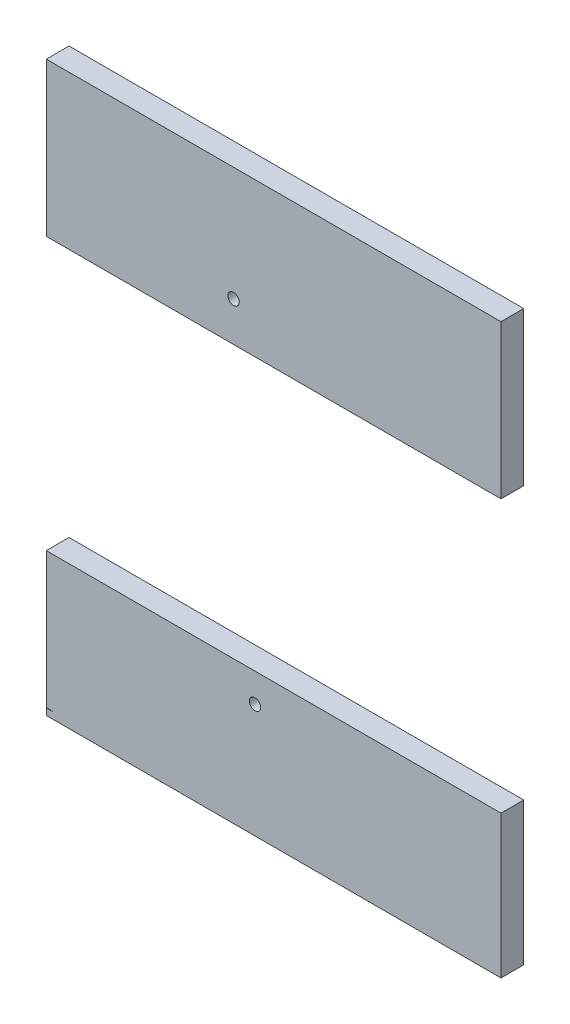
ISO-10303-21;
HEADER;
FILE_DESCRIPTION(('STEP AP214'),'2;1');
FILE_NAME('part.step','',(''),(''),'','','');
FILE_SCHEMA(('AUTOMOTIVE_DESIGN { 1 0 10303 214 1 1 1 1 }'));
ENDSEC;
DATA;
#1=APPLICATION_CONTEXT('core data for automotive mechanical design processes');
#2=APPLICATION_PROTOCOL_DEFINITION('international standard','automotive_design',2000,#1);
#3=PRODUCT_CONTEXT('',#1,'mechanical');
#4=PRODUCT('Part','Part','',(#3));
#5=PRODUCT_RELATED_PRODUCT_CATEGORY('part','',(#4));
#6=PRODUCT_DEFINITION_FORMATION('','',#4);
#7=PRODUCT_DEFINITION_CONTEXT('part definition',#1,'design');
#8=PRODUCT_DEFINITION('design','',#6,#7);
#9=PRODUCT_DEFINITION_SHAPE('','',#8);
#10=(LENGTH_UNIT() NAMED_UNIT(*) SI_UNIT(.MILLI.,.METRE.));
#11=(NAMED_UNIT(*) PLANE_ANGLE_UNIT() SI_UNIT($,.RADIAN.));
#12=(NAMED_UNIT(*) SI_UNIT($,.STERADIAN.) SOLID_ANGLE_UNIT());
#13=UNCERTAINTY_MEASURE_WITH_UNIT(LENGTH_MEASURE(1.E-05),#10,'distance_accuracy_value','');
#14=(GEOMETRIC_REPRESENTATION_CONTEXT(3) GLOBAL_UNCERTAINTY_ASSIGNED_CONTEXT((#13)) GLOBAL_UNIT_ASSIGNED_CONTEXT((#10,
#11,#12)) REPRESENTATION_CONTEXT('',''));
#15=CARTESIAN_POINT('',(0.,0.,0.));
#16=DIRECTION('',(0.,0.,1.));
#17=DIRECTION('',(1.,0.,0.));
#18=AXIS2_PLACEMENT_3D('',#15,#16,#17);
#19=CARTESIAN_POINT('',(0.0665366000004486,-93.6665366,0.));
#20=DIRECTION('',(0.,0.,1.));
#21=DIRECTION('',(1.,0.,0.));
#22=AXIS2_PLACEMENT_3D('',#19,#20,#21);
#23=PLANE('',#22);
#24=CARTESIAN_POINT('',(-8.12417443530146,-74.9185412321204,0.));
#25=DIRECTION('',(0.,0.,-1.));
#26=DIRECTION('',(-1.,0.,0.));
#27=AXIS2_PLACEMENT_3D('',#24,#25,#26);
#28=CIRCLE('',#27,2.5);
#29=CARTESIAN_POINT('',(-5.62417443530146,-74.9185412321204,0.));
#30=VERTEX_POINT('',#29);
#31=EDGE_CURVE('P0_E111',#30,#30,#28,.T.);
#32=ORIENTED_EDGE('',*,*,#31,.F.);
#33=EDGE_LOOP('',(#32));
#34=FACE_BOUND('',#33,.T.);
#35=DIRECTION('',(-1.,0.,0.));
#36=VECTOR('',#35,1.);
#37=CARTESIAN_POINT('',(100.066536600001,-62.2665366,0.));
#38=LINE('',#37,#36);
#39=CARTESIAN_POINT('',(100.066536600001,-62.2665366,0.));
#40=VERTEX_POINT('',#39);
#41=CARTESIAN_POINT('',(-99.9334633999999,-62.2665366235759,0.));
#42=VERTEX_POINT('',#41);
#43=EDGE_CURVE('P0_E25',#40,#42,#38,.T.);
#44=ORIENTED_EDGE('',*,*,#43,.F.);
#45=DIRECTION('',(0.,1.,0.));
#46=VECTOR('',#45,1.);
#47=CARTESIAN_POINT('',(100.0665366,-125.0665366,0.));
#48=LINE('',#47,#46);
#49=CARTESIAN_POINT('',(100.0665366,-125.0665366,0.));
#50=VERTEX_POINT('',#49);
#51=EDGE_CURVE('P0_E130',#50,#40,#48,.T.);
#52=ORIENTED_EDGE('',*,*,#51,.F.);
#53=DIRECTION('',(1.,0.,0.));
#54=VECTOR('',#53,1.);
#55=CARTESIAN_POINT('',(-99.9334634,-125.0665366,0.));
#56=LINE('',#55,#54);
#57=CARTESIAN_POINT('',(-99.9334634,-125.0665366,0.));
#58=VERTEX_POINT('',#57);
#59=EDGE_CURVE('P0_E150',#58,#50,#56,.T.);
#60=ORIENTED_EDGE('',*,*,#59,.F.);
#61=DIRECTION('',(0.,-1.,0.));
#62=VECTOR('',#61,1.);
#63=CARTESIAN_POINT('',(-99.9334634,124.9334634,0.));
#64=LINE('',#63,#62);
#65=CARTESIAN_POINT('',(-99.9334633999999,-122.166536623576,0.));
#66=VERTEX_POINT('',#65);
#67=EDGE_CURVE('P0_E136',#66,#58,#64,.T.);
#68=ORIENTED_EDGE('',*,*,#67,.F.);
#69=DIRECTION('',(-1.,0.,0.));
#70=VECTOR('',#69,1.);
#71=CARTESIAN_POINT('',(-96.9334634,-122.166536623576,0.));
#72=LINE('',#71,#70);
#73=CARTESIAN_POINT('',(-96.9334634,-122.166536623576,0.));
#74=VERTEX_POINT('',#73);
#75=EDGE_CURVE('P0_E169',#74,#66,#72,.T.);
#76=ORIENTED_EDGE('',*,*,#75,.F.);
#77=DIRECTION('',(0.,-1.,0.));
#78=VECTOR('',#77,1.);
#79=CARTESIAN_POINT('',(-96.9334634000001,-102.166536623576,0.));
#80=LINE('',#79,#78);
#81=CARTESIAN_POINT('',(-96.9334634,-122.0665366,0.));
#82=VERTEX_POINT('',#81);
#83=EDGE_CURVE('P0_E159',#82,#74,#80,.T.);
#84=ORIENTED_EDGE('',*,*,#83,.F.);
#85=DIRECTION('',(1.,0.,0.));
#86=VECTOR('',#85,1.);
#87=CARTESIAN_POINT('',(-99.9334634,-122.0665366,0.));
#88=LINE('',#87,#86);
#89=CARTESIAN_POINT('',(-99.9334634,-122.0665366,0.));
#90=VERTEX_POINT('',#89);
#91=EDGE_CURVE('P0_E181',#90,#82,#88,.T.);
#92=ORIENTED_EDGE('',*,*,#91,.F.);
#93=DIRECTION('',(0.,-1.,0.));
#94=VECTOR('',#93,1.);
#95=CARTESIAN_POINT('',(-99.9334634,124.9334634,0.));
#96=LINE('',#95,#94);
#97=EDGE_CURVE('P0_E195',#42,#90,#96,.T.);
#98=ORIENTED_EDGE('',*,*,#97,.F.);
#99=EDGE_LOOP('',(#44,#52,#60,#68,#76,#84,#92,#98));
#100=FACE_BOUND('',#99,.T.);
#101=ADVANCED_FACE('P0_F17',(#34,#100),#23,.F.);
#102=CARTESIAN_POINT('',(0.0665366000004486,-93.6665366,10.));
#103=DIRECTION('',(0.,0.,1.));
#104=DIRECTION('',(1.,0.,0.));
#105=AXIS2_PLACEMENT_3D('',#102,#103,#104);
#106=PLANE('',#105);
#107=CARTESIAN_POINT('',(-8.12417443530146,-74.9185412321204,10.));
#108=DIRECTION('',(0.,0.,-1.));
#109=DIRECTION('',(-1.,0.,0.));
#110=AXIS2_PLACEMENT_3D('',#107,#108,#109);
#111=CIRCLE('',#110,2.5);
#112=CARTESIAN_POINT('',(-5.62417443530146,-74.9185412321204,10.));
#113=VERTEX_POINT('',#112);
#114=EDGE_CURVE('P0_E115',#113,#113,#111,.T.);
#115=ORIENTED_EDGE('',*,*,#114,.T.);
#116=EDGE_LOOP('',(#115));
#117=FACE_BOUND('',#116,.T.);
#118=DIRECTION('',(-1.,0.,0.));
#119=VECTOR('',#118,1.);
#120=CARTESIAN_POINT('',(100.066536600001,-62.2665366,10.));
#121=LINE('',#120,#119);
#122=CARTESIAN_POINT('',(100.066536600001,-62.2665366,10.));
#123=VERTEX_POINT('',#122);
#124=CARTESIAN_POINT('',(-99.9334633999999,-62.2665366235759,10.));
#125=VERTEX_POINT('',#124);
#126=EDGE_CURVE('P0_E11',#123,#125,#121,.T.);
#127=ORIENTED_EDGE('',*,*,#126,.T.);
#128=DIRECTION('',(0.,-1.,0.));
#129=VECTOR('',#128,1.);
#130=CARTESIAN_POINT('',(-99.9334634,124.9334634,10.));
#131=LINE('',#130,#129);
#132=CARTESIAN_POINT('',(-99.9334633999999,-122.0665366,10.));
#133=VERTEX_POINT('',#132);
#134=EDGE_CURVE('P0_E194',#125,#133,#131,.T.);
#135=ORIENTED_EDGE('',*,*,#134,.T.);
#136=DIRECTION('',(1.,0.,0.));
#137=VECTOR('',#136,1.);
#138=CARTESIAN_POINT('',(-99.9334634,-122.0665366,10.));
#139=LINE('',#138,#137);
#140=CARTESIAN_POINT('',(-96.9334634,-122.0665366,10.));
#141=VERTEX_POINT('',#140);
#142=EDGE_CURVE('P0_E184',#133,#141,#139,.T.);
#143=ORIENTED_EDGE('',*,*,#142,.T.);
#144=DIRECTION('',(0.,-1.,0.));
#145=VECTOR('',#144,1.);
#146=CARTESIAN_POINT('',(-96.9334634000001,-102.166536623576,10.));
#147=LINE('',#146,#145);
#148=CARTESIAN_POINT('',(-96.9334634,-122.166536623576,10.));
#149=VERTEX_POINT('',#148);
#150=EDGE_CURVE('P0_E175',#141,#149,#147,.T.);
#151=ORIENTED_EDGE('',*,*,#150,.T.);
#152=DIRECTION('',(-1.,0.,0.));
#153=VECTOR('',#152,1.);
#154=CARTESIAN_POINT('',(-96.9334634,-122.166536623576,10.));
#155=LINE('',#154,#153);
#156=CARTESIAN_POINT('',(-99.9334633999999,-122.166536623576,10.));
#157=VERTEX_POINT('',#156);
#158=EDGE_CURVE('P0_E161',#149,#157,#155,.T.);
#159=ORIENTED_EDGE('',*,*,#158,.T.);
#160=DIRECTION('',(0.,-1.,0.));
#161=VECTOR('',#160,1.);
#162=CARTESIAN_POINT('',(-99.9334634,124.9334634,10.));
#163=LINE('',#162,#161);
#164=CARTESIAN_POINT('',(-99.9334633999999,-125.0665366,10.));
#165=VERTEX_POINT('',#164);
#166=EDGE_CURVE('P0_E137',#157,#165,#163,.T.);
#167=ORIENTED_EDGE('',*,*,#166,.T.);
#168=DIRECTION('',(1.,0.,0.));
#169=VECTOR('',#168,1.);
#170=CARTESIAN_POINT('',(-99.9334634,-125.0665366,10.));
#171=LINE('',#170,#169);
#172=CARTESIAN_POINT('',(100.0665366,-125.0665366,10.));
#173=VERTEX_POINT('',#172);
#174=EDGE_CURVE('P0_E147',#165,#173,#171,.T.);
#175=ORIENTED_EDGE('',*,*,#174,.T.);
#176=DIRECTION('',(0.,1.,0.));
#177=VECTOR('',#176,1.);
#178=CARTESIAN_POINT('',(100.0665366,-125.0665366,10.));
#179=LINE('',#178,#177);
#180=EDGE_CURVE('P0_E134',#173,#123,#179,.T.);
#181=ORIENTED_EDGE('',*,*,#180,.T.);
#182=EDGE_LOOP('',(#127,#135,#143,#151,#159,#167,#175,#181));
#183=FACE_BOUND('',#182,.T.);
#184=ADVANCED_FACE('P0_F119',(#117,#183),#106,.T.);
#185=CARTESIAN_POINT('',(100.066536600001,-62.2665366,0.));
#186=DIRECTION('',(0.,1.,0.));
#187=DIRECTION('',(1.,0.,0.));
#188=AXIS2_PLACEMENT_3D('',#185,#186,#187);
#189=PLANE('',#188);
#190=ORIENTED_EDGE('',*,*,#43,.T.);
#191=DIRECTION('',(0.,0.,1.));
#192=VECTOR('',#191,1.);
#193=CARTESIAN_POINT('',(-99.9334633999999,-62.2665366235759,0.));
#194=LINE('',#193,#192);
#195=EDGE_CURVE('P0_E196',#42,#125,#194,.T.);
#196=ORIENTED_EDGE('',*,*,#195,.T.);
#197=ORIENTED_EDGE('',*,*,#126,.F.);
#198=DIRECTION('',(0.,0.,1.));
#199=VECTOR('',#198,1.);
#200=CARTESIAN_POINT('',(100.066536600001,-62.2665366,0.));
#201=LINE('',#200,#199);
#202=EDGE_CURVE('P0_E131',#40,#123,#201,.T.);
#203=ORIENTED_EDGE('',*,*,#202,.F.);
#204=EDGE_LOOP('',(#190,#196,#197,#203));
#205=FACE_BOUND('',#204,.T.);
#206=ADVANCED_FACE('P0_F300',(#205),#189,.T.);
#207=CARTESIAN_POINT('',(-99.9334634,-62.2665366235759,0.));
#208=DIRECTION('',(-1.,0.,0.));
#209=DIRECTION('',(0.,1.,0.));
#210=AXIS2_PLACEMENT_3D('',#207,#208,#209);
#211=PLANE('',#210);
#212=ORIENTED_EDGE('',*,*,#97,.T.);
#213=DIRECTION('',(0.,0.,1.));
#214=VECTOR('',#213,1.);
#215=CARTESIAN_POINT('',(-99.9334634,-122.0665366,0.));
#216=LINE('',#215,#214);
#217=EDGE_CURVE('P0_E187',#90,#133,#216,.T.);
#218=ORIENTED_EDGE('',*,*,#217,.T.);
#219=ORIENTED_EDGE('',*,*,#134,.F.);
#220=ORIENTED_EDGE('',*,*,#195,.F.);
#221=EDGE_LOOP('',(#212,#218,#219,#220));
#222=FACE_BOUND('',#221,.T.);
#223=ADVANCED_FACE('P0_F291',(#222),#211,.T.);
#224=CARTESIAN_POINT('',(-99.9334634,-122.0665366,0.));
#225=DIRECTION('',(0.,-1.,0.));
#226=DIRECTION('',(0.,0.,-1.));
#227=AXIS2_PLACEMENT_3D('',#224,#225,#226);
#228=PLANE('',#227);
#229=ORIENTED_EDGE('',*,*,#91,.T.);
#230=DIRECTION('',(0.,0.,1.));
#231=VECTOR('',#230,1.);
#232=CARTESIAN_POINT('',(-96.9334634,-122.0665366,0.));
#233=LINE('',#232,#231);
#234=EDGE_CURVE('P0_E178',#82,#141,#233,.T.);
#235=ORIENTED_EDGE('',*,*,#234,.T.);
#236=ORIENTED_EDGE('',*,*,#142,.F.);
#237=ORIENTED_EDGE('',*,*,#217,.F.);
#238=EDGE_LOOP('',(#229,#235,#236,#237));
#239=FACE_BOUND('',#238,.T.);
#240=ADVANCED_FACE('P0_F296',(#239),#228,.T.);
#241=CARTESIAN_POINT('',(-96.9334634,-122.0665366,0.));
#242=DIRECTION('',(-1.,0.,0.));
#243=DIRECTION('',(0.,1.,0.));
#244=AXIS2_PLACEMENT_3D('',#241,#242,#243);
#245=PLANE('',#244);
#246=ORIENTED_EDGE('',*,*,#83,.T.);
#247=DIRECTION('',(0.,0.,1.));
#248=VECTOR('',#247,1.);
#249=CARTESIAN_POINT('',(-96.9334634,-122.166536623576,0.));
#250=LINE('',#249,#248);
#251=EDGE_CURVE('P0_E156',#74,#149,#250,.T.);
#252=ORIENTED_EDGE('',*,*,#251,.T.);
#253=ORIENTED_EDGE('',*,*,#150,.F.);
#254=ORIENTED_EDGE('',*,*,#234,.F.);
#255=EDGE_LOOP('',(#246,#252,#253,#254));
#256=FACE_BOUND('',#255,.T.);
#257=ADVANCED_FACE('P0_F304',(#256),#245,.T.);
#258=CARTESIAN_POINT('',(-96.9334634,-122.166536623576,0.));
#259=DIRECTION('',(0.,1.,0.));
#260=DIRECTION('',(1.,0.,0.));
#261=AXIS2_PLACEMENT_3D('',#258,#259,#260);
#262=PLANE('',#261);
#263=ORIENTED_EDGE('',*,*,#75,.T.);
#264=DIRECTION('',(0.,0.,1.));
#265=VECTOR('',#264,1.);
#266=CARTESIAN_POINT('',(-99.9334633999999,-122.166536623576,0.));
#267=LINE('',#266,#265);
#268=EDGE_CURVE('P0_E163',#66,#157,#267,.T.);
#269=ORIENTED_EDGE('',*,*,#268,.T.);
#270=ORIENTED_EDGE('',*,*,#158,.F.);
#271=ORIENTED_EDGE('',*,*,#251,.F.);
#272=EDGE_LOOP('',(#263,#269,#270,#271));
#273=FACE_BOUND('',#272,.T.);
#274=ADVANCED_FACE('P0_F313',(#273),#262,.T.);
#275=CARTESIAN_POINT('',(-99.9334634,-122.166536623576,0.));
#276=DIRECTION('',(-1.,0.,0.));
#277=DIRECTION('',(0.,1.,0.));
#278=AXIS2_PLACEMENT_3D('',#275,#276,#277);
#279=PLANE('',#278);
#280=ORIENTED_EDGE('',*,*,#67,.T.);
#281=DIRECTION('',(0.,0.,1.));
#282=VECTOR('',#281,1.);
#283=CARTESIAN_POINT('',(-99.9334634,-125.0665366,0.));
#284=LINE('',#283,#282);
#285=EDGE_CURVE('P0_E139',#58,#165,#284,.T.);
#286=ORIENTED_EDGE('',*,*,#285,.T.);
#287=ORIENTED_EDGE('',*,*,#166,.F.);
#288=ORIENTED_EDGE('',*,*,#268,.F.);
#289=EDGE_LOOP('',(#280,#286,#287,#288));
#290=FACE_BOUND('',#289,.T.);
#291=ADVANCED_FACE('P0_F312',(#290),#279,.T.);
#292=CARTESIAN_POINT('',(-99.9334634,-125.0665366,0.));
#293=DIRECTION('',(0.,-1.,0.));
#294=DIRECTION('',(0.,0.,-1.));
#295=AXIS2_PLACEMENT_3D('',#292,#293,#294);
#296=PLANE('',#295);
#297=ORIENTED_EDGE('',*,*,#59,.T.);
#298=DIRECTION('',(0.,0.,1.));
#299=VECTOR('',#298,1.);
#300=CARTESIAN_POINT('',(100.0665366,-125.0665366,0.));
#301=LINE('',#300,#299);
#302=EDGE_CURVE('P0_E141',#50,#173,#301,.T.);
#303=ORIENTED_EDGE('',*,*,#302,.T.);
#304=ORIENTED_EDGE('',*,*,#174,.F.);
#305=ORIENTED_EDGE('',*,*,#285,.F.);
#306=EDGE_LOOP('',(#297,#303,#304,#305));
#307=FACE_BOUND('',#306,.T.);
#308=ADVANCED_FACE('P0_F322',(#307),#296,.T.);
#309=CARTESIAN_POINT('',(100.0665366,-125.0665366,0.));
#310=DIRECTION('',(1.,0.,0.));
#311=DIRECTION('',(0.,1.,0.));
#312=AXIS2_PLACEMENT_3D('',#309,#310,#311);
#313=PLANE('',#312);
#314=ORIENTED_EDGE('',*,*,#51,.T.);
#315=ORIENTED_EDGE('',*,*,#202,.T.);
#316=ORIENTED_EDGE('',*,*,#180,.F.);
#317=ORIENTED_EDGE('',*,*,#302,.F.);
#318=EDGE_LOOP('',(#314,#315,#316,#317));
#319=FACE_BOUND('',#318,.T.);
#320=ADVANCED_FACE('P0_F340',(#319),#313,.T.);
#321=CARTESIAN_POINT('',(-8.12417443530146,-74.9185412321204,0.));
#322=DIRECTION('',(0.,0.,1.));
#323=DIRECTION('',(-1.,0.,0.));
#324=AXIS2_PLACEMENT_3D('',#321,#322,#323);
#325=CYLINDRICAL_SURFACE('',#324,2.5);
#326=ORIENTED_EDGE('',*,*,#114,.F.);
#327=DIRECTION('',(0.,0.,-1.));
#328=VECTOR('',#327,1.);
#329=CARTESIAN_POINT('',(-5.62417443530146,-74.9185412321204,0.));
#330=LINE('',#329,#328);
#331=EDGE_CURVE('P0_E108',#113,#30,#330,.T.);
#332=ORIENTED_EDGE('',*,*,#331,.T.);
#333=ORIENTED_EDGE('',*,*,#31,.T.);
#334=ORIENTED_EDGE('',*,*,#331,.F.);
#335=EDGE_LOOP('',(#326,#332,#333,#334));
#336=FACE_BOUND('',#335,.T.);
#337=ADVANCED_FACE('P0_F112',(#336),#325,.F.);
#338=CLOSED_SHELL('',(#101,#184,#206,#223,#240,#257,#274,#291,#308,#320,#337));
#339=MANIFOLD_SOLID_BREP('P0_B1',#338);
#340=CARTESIAN_POINT('',(0.0665366000001111,91.1834634,0.));
#341=DIRECTION('',(0.,0.,1.));
#342=DIRECTION('',(1.,0.,0.));
#343=AXIS2_PLACEMENT_3D('',#340,#341,#342);
#344=PLANE('',#343);
#345=CARTESIAN_POINT('',(-17.5427523646985,74.7854680321204,0.));
#346=DIRECTION('',(0.,0.,-1.));
#347=DIRECTION('',(-1.,0.,0.));
#348=AXIS2_PLACEMENT_3D('',#345,#346,#347);
#349=CIRCLE('',#348,2.5);
#350=CARTESIAN_POINT('',(-15.0427523646985,74.7854680321204,0.));
#351=VERTEX_POINT('',#350);
#352=EDGE_CURVE('P1_E80',#351,#351,#349,.T.);
#353=ORIENTED_EDGE('',*,*,#352,.F.);
#354=EDGE_LOOP('',(#353));
#355=FACE_BOUND('',#354,.T.);
#356=DIRECTION('',(1.,0.,0.));
#357=VECTOR('',#356,1.);
#358=CARTESIAN_POINT('',(97.0665366000009,57.4334634,0.));
#359=LINE('',#358,#357);
#360=CARTESIAN_POINT('',(-99.9334634,57.4334633764241,0.));
#361=VERTEX_POINT('',#360);
#362=CARTESIAN_POINT('',(100.0665366,57.4334634,0.));
#363=VERTEX_POINT('',#362);
#364=EDGE_CURVE('P1_E20',#361,#363,#359,.T.);
#365=ORIENTED_EDGE('',*,*,#364,.F.);
#366=DIRECTION('',(0.,-1.,0.));
#367=VECTOR('',#366,1.);
#368=CARTESIAN_POINT('',(-99.9334634,124.9334634,0.));
#369=LINE('',#368,#367);
#370=CARTESIAN_POINT('',(-99.9334634,124.9334634,0.));
#371=VERTEX_POINT('',#370);
#372=EDGE_CURVE('P1_E92',#371,#361,#369,.T.);
#373=ORIENTED_EDGE('',*,*,#372,.F.);
#374=DIRECTION('',(-1.,0.,0.));
#375=VECTOR('',#374,1.);
#376=CARTESIAN_POINT('',(77.0665366,124.9334634,0.));
#377=LINE('',#376,#375);
#378=CARTESIAN_POINT('',(100.0665366,124.9334634,0.));
#379=VERTEX_POINT('',#378);
#380=EDGE_CURVE('P1_E109',#379,#371,#377,.T.);
#381=ORIENTED_EDGE('',*,*,#380,.F.);
#382=DIRECTION('',(0.,1.,0.));
#383=VECTOR('',#382,1.);
#384=CARTESIAN_POINT('',(100.0665366,-125.0665366,0.));
#385=LINE('',#384,#383);
#386=EDGE_CURVE('P1_E93',#363,#379,#385,.T.);
#387=ORIENTED_EDGE('',*,*,#386,.F.);
#388=EDGE_LOOP('',(#365,#373,#381,#387));
#389=FACE_BOUND('',#388,.T.);
#390=ADVANCED_FACE('P1_F17',(#355,#389),#344,.F.);
#391=CARTESIAN_POINT('',(0.0665366000001111,91.1834634,10.));
#392=DIRECTION('',(0.,0.,1.));
#393=DIRECTION('',(1.,0.,0.));
#394=AXIS2_PLACEMENT_3D('',#391,#392,#393);
#395=PLANE('',#394);
#396=CARTESIAN_POINT('',(-17.5427523646985,74.7854680321204,10.));
#397=DIRECTION('',(0.,0.,-1.));
#398=DIRECTION('',(-1.,0.,0.));
#399=AXIS2_PLACEMENT_3D('',#396,#397,#398);
#400=CIRCLE('',#399,2.5);
#401=CARTESIAN_POINT('',(-15.0427523646985,74.7854680321204,10.));
#402=VERTEX_POINT('',#401);
#403=EDGE_CURVE('P1_E74',#402,#402,#400,.T.);
#404=ORIENTED_EDGE('',*,*,#403,.T.);
#405=EDGE_LOOP('',(#404));
#406=FACE_BOUND('',#405,.T.);
#407=DIRECTION('',(1.,0.,0.));
#408=VECTOR('',#407,1.);
#409=CARTESIAN_POINT('',(97.0665366000009,57.4334634,10.));
#410=LINE('',#409,#408);
#411=CARTESIAN_POINT('',(-99.9334634,57.4334633764241,10.));
#412=VERTEX_POINT('',#411);
#413=CARTESIAN_POINT('',(100.0665366,57.4334634,10.));
#414=VERTEX_POINT('',#413);
#415=EDGE_CURVE('P1_E11',#412,#414,#410,.T.);
#416=ORIENTED_EDGE('',*,*,#415,.T.);
#417=DIRECTION('',(0.,1.,0.));
#418=VECTOR('',#417,1.);
#419=CARTESIAN_POINT('',(100.0665366,-125.0665366,10.));
#420=LINE('',#419,#418);
#421=CARTESIAN_POINT('',(100.0665366,124.9334634,10.));
#422=VERTEX_POINT('',#421);
#423=EDGE_CURVE('P1_E86',#414,#422,#420,.T.);
#424=ORIENTED_EDGE('',*,*,#423,.T.);
#425=DIRECTION('',(-1.,0.,0.));
#426=VECTOR('',#425,1.);
#427=CARTESIAN_POINT('',(77.0665366,124.9334634,10.));
#428=LINE('',#427,#426);
#429=CARTESIAN_POINT('',(-99.9334634,124.9334634,10.));
#430=VERTEX_POINT('',#429);
#431=EDGE_CURVE('P1_E114',#422,#430,#428,.T.);
#432=ORIENTED_EDGE('',*,*,#431,.T.);
#433=DIRECTION('',(0.,-1.,0.));
#434=VECTOR('',#433,1.);
#435=CARTESIAN_POINT('',(-99.9334634,124.9334634,10.));
#436=LINE('',#435,#434);
#437=EDGE_CURVE('P1_E99',#430,#412,#436,.T.);
#438=ORIENTED_EDGE('',*,*,#437,.T.);
#439=EDGE_LOOP('',(#416,#424,#432,#438));
#440=FACE_BOUND('',#439,.T.);
#441=ADVANCED_FACE('P1_F81',(#406,#440),#395,.T.);
#442=CARTESIAN_POINT('',(-99.9334634,57.4334633999994,0.));
#443=DIRECTION('',(0.,-1.,0.));
#444=DIRECTION('',(0.,0.,-1.));
#445=AXIS2_PLACEMENT_3D('',#442,#443,#444);
#446=PLANE('',#445);
#447=ORIENTED_EDGE('',*,*,#364,.T.);
#448=DIRECTION('',(0.,0.,1.));
#449=VECTOR('',#448,1.);
#450=CARTESIAN_POINT('',(100.0665366,57.4334634,0.));
#451=LINE('',#450,#449);
#452=EDGE_CURVE('P1_E89',#363,#414,#451,.T.);
#453=ORIENTED_EDGE('',*,*,#452,.T.);
#454=ORIENTED_EDGE('',*,*,#415,.F.);
#455=DIRECTION('',(0.,0.,1.));
#456=VECTOR('',#455,1.);
#457=CARTESIAN_POINT('',(-99.9334634,57.4334633764241,0.));
#458=LINE('',#457,#456);
#459=EDGE_CURVE('P1_E97',#361,#412,#458,.T.);
#460=ORIENTED_EDGE('',*,*,#459,.F.);
#461=EDGE_LOOP('',(#447,#453,#454,#460));
#462=FACE_BOUND('',#461,.T.);
#463=ADVANCED_FACE('P1_F141',(#462),#446,.T.);
#464=CARTESIAN_POINT('',(100.0665366,57.4334634,0.));
#465=DIRECTION('',(1.,0.,0.));
#466=DIRECTION('',(0.,1.,0.));
#467=AXIS2_PLACEMENT_3D('',#464,#465,#466);
#468=PLANE('',#467);
#469=ORIENTED_EDGE('',*,*,#386,.T.);
#470=DIRECTION('',(0.,0.,1.));
#471=VECTOR('',#470,1.);
#472=CARTESIAN_POINT('',(100.0665366,124.9334634,0.));
#473=LINE('',#472,#471);
#474=EDGE_CURVE('P1_E116',#379,#422,#473,.T.);
#475=ORIENTED_EDGE('',*,*,#474,.T.);
#476=ORIENTED_EDGE('',*,*,#423,.F.);
#477=ORIENTED_EDGE('',*,*,#452,.F.);
#478=EDGE_LOOP('',(#469,#475,#476,#477));
#479=FACE_BOUND('',#478,.T.);
#480=ADVANCED_FACE('P1_F127',(#479),#468,.T.);
#481=CARTESIAN_POINT('',(100.0665366,124.9334634,0.));
#482=DIRECTION('',(0.,1.,0.));
#483=DIRECTION('',(1.,0.,0.));
#484=AXIS2_PLACEMENT_3D('',#481,#482,#483);
#485=PLANE('',#484);
#486=ORIENTED_EDGE('',*,*,#380,.T.);
#487=DIRECTION('',(0.,0.,1.));
#488=VECTOR('',#487,1.);
#489=CARTESIAN_POINT('',(-99.9334634,124.9334634,0.));
#490=LINE('',#489,#488);
#491=EDGE_CURVE('P1_E103',#371,#430,#490,.T.);
#492=ORIENTED_EDGE('',*,*,#491,.T.);
#493=ORIENTED_EDGE('',*,*,#431,.F.);
#494=ORIENTED_EDGE('',*,*,#474,.F.);
#495=EDGE_LOOP('',(#486,#492,#493,#494));
#496=FACE_BOUND('',#495,.T.);
#497=ADVANCED_FACE('P1_F134',(#496),#485,.T.);
#498=CARTESIAN_POINT('',(-99.9334634,124.9334634,0.));
#499=DIRECTION('',(-1.,0.,0.));
#500=DIRECTION('',(0.,1.,0.));
#501=AXIS2_PLACEMENT_3D('',#498,#499,#500);
#502=PLANE('',#501);
#503=ORIENTED_EDGE('',*,*,#372,.T.);
#504=ORIENTED_EDGE('',*,*,#459,.T.);
#505=ORIENTED_EDGE('',*,*,#437,.F.);
#506=ORIENTED_EDGE('',*,*,#491,.F.);
#507=EDGE_LOOP('',(#503,#504,#505,#506));
#508=FACE_BOUND('',#507,.T.);
#509=ADVANCED_FACE('P1_F139',(#508),#502,.T.);
#510=CARTESIAN_POINT('',(-17.5427523646985,74.7854680321204,0.));
#511=DIRECTION('',(0.,0.,1.));
#512=DIRECTION('',(-1.,0.,0.));
#513=AXIS2_PLACEMENT_3D('',#510,#511,#512);
#514=CYLINDRICAL_SURFACE('',#513,2.5);
#515=ORIENTED_EDGE('',*,*,#403,.F.);
#516=DIRECTION('',(0.,0.,-1.));
#517=VECTOR('',#516,1.);
#518=CARTESIAN_POINT('',(-15.0427523646985,74.7854680321204,0.));
#519=LINE('',#518,#517);
#520=EDGE_CURVE('P1_E71',#402,#351,#519,.T.);
#521=ORIENTED_EDGE('',*,*,#520,.T.);
#522=ORIENTED_EDGE('',*,*,#352,.T.);
#523=ORIENTED_EDGE('',*,*,#520,.F.);
#524=EDGE_LOOP('',(#515,#521,#522,#523));
#525=FACE_BOUND('',#524,.T.);
#526=ADVANCED_FACE('P1_F72',(#525),#514,.F.);
#527=CLOSED_SHELL('',(#390,#441,#463,#480,#497,#509,#526));
#528=MANIFOLD_SOLID_BREP('P1_B1',#527);
#529=ADVANCED_BREP_SHAPE_REPRESENTATION('',(#18,#339,#528),#14);
#530=SHAPE_DEFINITION_REPRESENTATION(#9,#529);
ENDSEC;
END-ISO-10303-21;
